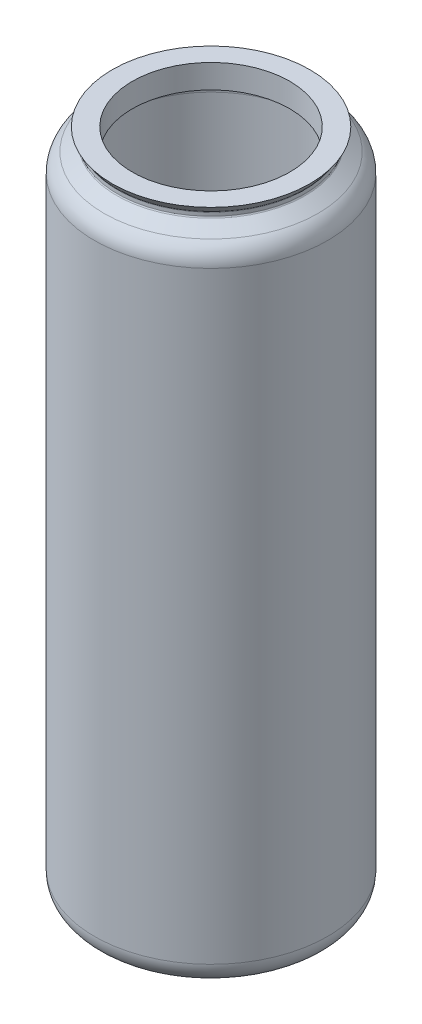
ISO-10303-21;
HEADER;
FILE_DESCRIPTION(('STEP AP214'),'2;1');
FILE_NAME('part.step','',(''),(''),'','','');
FILE_SCHEMA(('AUTOMOTIVE_DESIGN { 1 0 10303 214 1 1 1 1 }'));
ENDSEC;
DATA;
#1=APPLICATION_CONTEXT('core data for automotive mechanical design processes');
#2=APPLICATION_PROTOCOL_DEFINITION('international standard','automotive_design',2000,#1);
#3=PRODUCT_CONTEXT('',#1,'mechanical');
#4=PRODUCT('Part','Part','',(#3));
#5=PRODUCT_RELATED_PRODUCT_CATEGORY('part','',(#4));
#6=PRODUCT_DEFINITION_FORMATION('','',#4);
#7=PRODUCT_DEFINITION_CONTEXT('part definition',#1,'design');
#8=PRODUCT_DEFINITION('design','',#6,#7);
#9=PRODUCT_DEFINITION_SHAPE('','',#8);
#10=(LENGTH_UNIT() NAMED_UNIT(*) SI_UNIT(.MILLI.,.METRE.));
#11=(NAMED_UNIT(*) PLANE_ANGLE_UNIT() SI_UNIT($,.RADIAN.));
#12=(NAMED_UNIT(*) SI_UNIT($,.STERADIAN.) SOLID_ANGLE_UNIT());
#13=UNCERTAINTY_MEASURE_WITH_UNIT(LENGTH_MEASURE(1.E-05),#10,'distance_accuracy_value','');
#14=(GEOMETRIC_REPRESENTATION_CONTEXT(3) GLOBAL_UNCERTAINTY_ASSIGNED_CONTEXT((#13)) GLOBAL_UNIT_ASSIGNED_CONTEXT((#10,
#11,#12)) REPRESENTATION_CONTEXT('',''));
#15=CARTESIAN_POINT('',(0.,0.,0.));
#16=DIRECTION('',(0.,0.,1.));
#17=DIRECTION('',(1.,0.,0.));
#18=AXIS2_PLACEMENT_3D('',#15,#16,#17);
#19=CARTESIAN_POINT('',(0.,208.779461047513,0.));
#20=DIRECTION('',(0.,-1.,0.));
#21=DIRECTION('',(0.,0.,-1.));
#22=AXIS2_PLACEMENT_3D('',#19,#20,#21);
#23=TOROIDAL_SURFACE('',#22,31.2894047123911,7.62);
#24=CARTESIAN_POINT('',(0.,215.002199937633,0.));
#25=DIRECTION('',(0.,1.,0.));
#26=DIRECTION('',(0.,0.,1.));
#27=AXIS2_PLACEMENT_3D('',#24,#25,#26);
#28=CIRCLE('',#27,35.6873497672301);
#29=CARTESIAN_POINT('',(0.,215.002199937633,35.6873497672301));
#30=VERTEX_POINT('',#29);
#31=EDGE_CURVE('E63',#30,#30,#28,.T.);
#32=ORIENTED_EDGE('',*,*,#31,.F.);
#33=EDGE_LOOP('',(#32));
#34=FACE_BOUND('',#33,.T.);
#35=CARTESIAN_POINT('',(0.,208.779461047513,0.));
#36=DIRECTION('',(0.,-1.,0.));
#37=DIRECTION('',(0.,0.,-1.));
#38=AXIS2_PLACEMENT_3D('',#35,#36,#37);
#39=CIRCLE('',#38,38.9094047123911);
#40=CARTESIAN_POINT('',(0.,208.779461047513,-38.9094047123911));
#41=VERTEX_POINT('',#40);
#42=EDGE_CURVE('E60',#41,#41,#39,.T.);
#43=ORIENTED_EDGE('',*,*,#42,.F.);
#44=EDGE_LOOP('',(#43));
#45=FACE_BOUND('',#44,.T.);
#46=ADVANCED_FACE('F34',(#34,#45),#23,.T.);
#47=CARTESIAN_POINT('',(0.,0.,0.));
#48=DIRECTION('',(0.,1.,0.));
#49=DIRECTION('',(0.,0.,1.));
#50=AXIS2_PLACEMENT_3D('',#47,#48,#49);
#51=PLANE('',#50);
#52=CARTESIAN_POINT('',(0.,0.,0.));
#53=DIRECTION('',(0.,-1.,0.));
#54=DIRECTION('',(0.,0.,-1.));
#55=AXIS2_PLACEMENT_3D('',#52,#53,#54);
#56=CIRCLE('',#55,11.90625);
#57=CARTESIAN_POINT('',(0.,0.,-11.90625));
#58=VERTEX_POINT('',#57);
#59=EDGE_CURVE('E96',#58,#58,#56,.T.);
#60=ORIENTED_EDGE('',*,*,#59,.F.);
#61=EDGE_LOOP('',(#60));
#62=FACE_BOUND('',#61,.T.);
#63=CARTESIAN_POINT('',(0.,0.,0.));
#64=DIRECTION('',(0.,-1.,0.));
#65=DIRECTION('',(0.,0.,-1.));
#66=AXIS2_PLACEMENT_3D('',#63,#64,#65);
#67=CIRCLE('',#66,31.2894047123911);
#68=CARTESIAN_POINT('',(0.,0.,-31.2894047123911));
#69=VERTEX_POINT('',#68);
#70=EDGE_CURVE('E66',#69,#69,#67,.T.);
#71=ORIENTED_EDGE('',*,*,#70,.T.);
#72=EDGE_LOOP('',(#71));
#73=FACE_BOUND('',#72,.T.);
#74=ADVANCED_FACE('F122',(#62,#73),#51,.F.);
#75=CARTESIAN_POINT('',(0.,7.62,0.));
#76=DIRECTION('',(0.,-1.,0.));
#77=DIRECTION('',(0.,0.,-1.));
#78=AXIS2_PLACEMENT_3D('',#75,#76,#77);
#79=TOROIDAL_SURFACE('',#78,31.2894047123911,7.62);
#80=ORIENTED_EDGE('',*,*,#70,.F.);
#81=EDGE_LOOP('',(#80));
#82=FACE_BOUND('',#81,.T.);
#83=CARTESIAN_POINT('',(0.,7.62000000000005,0.));
#84=DIRECTION('',(0.,-1.,0.));
#85=DIRECTION('',(0.,0.,-1.));
#86=AXIS2_PLACEMENT_3D('',#83,#84,#85);
#87=CIRCLE('',#86,38.9094047123911);
#88=CARTESIAN_POINT('',(0.,7.62000000000005,-38.9094047123911));
#89=VERTEX_POINT('',#88);
#90=EDGE_CURVE('E69',#89,#89,#87,.T.);
#91=ORIENTED_EDGE('',*,*,#90,.T.);
#92=EDGE_LOOP('',(#91));
#93=FACE_BOUND('',#92,.T.);
#94=ADVANCED_FACE('F128',(#82,#93),#79,.T.);
#95=CARTESIAN_POINT('',(0.,0.,0.));
#96=DIRECTION('',(0.,-1.,0.));
#97=DIRECTION('',(0.,0.,-1.));
#98=AXIS2_PLACEMENT_3D('',#95,#96,#97);
#99=CYLINDRICAL_SURFACE('',#98,38.9094047123911);
#100=ORIENTED_EDGE('',*,*,#42,.T.);
#101=EDGE_LOOP('',(#100));
#102=FACE_BOUND('',#101,.T.);
#103=ORIENTED_EDGE('',*,*,#90,.F.);
#104=EDGE_LOOP('',(#103));
#105=FACE_BOUND('',#104,.T.);
#106=ADVANCED_FACE('F151',(#102,#105),#99,.T.);
#107=CARTESIAN_POINT('',(0.,218.159183173107,0.));
#108=DIRECTION('',(0.,-1.,0.));
#109=DIRECTION('',(0.,0.,-1.));
#110=AXIS2_PLACEMENT_3D('',#107,#108,#109);
#111=CONICAL_SURFACE('',#110,31.220472143731,0.955551903287283);
#112=CARTESIAN_POINT('',(0.,218.007369843931,0.));
#113=DIRECTION('',(0.,-1.,0.));
#114=DIRECTION('',(0.,0.,-1.));
#115=AXIS2_PLACEMENT_3D('',#112,#113,#114);
#116=CIRCLE('',#115,31.4352758067417);
#117=CARTESIAN_POINT('',(0.,218.007369843931,-31.4352758067417));
#118=VERTEX_POINT('',#117);
#119=EDGE_CURVE('E57',#118,#118,#116,.T.);
#120=ORIENTED_EDGE('',*,*,#119,.T.);
#121=EDGE_LOOP('',(#120));
#122=FACE_BOUND('',#121,.T.);
#123=ORIENTED_EDGE('',*,*,#31,.T.);
#124=EDGE_LOOP('',(#123));
#125=FACE_BOUND('',#124,.T.);
#126=ADVANCED_FACE('F147',(#122,#125),#111,.T.);
#127=CARTESIAN_POINT('',(0.,0.,0.));
#128=DIRECTION('',(0.,-1.,0.));
#129=DIRECTION('',(0.,0.,-1.));
#130=AXIS2_PLACEMENT_3D('',#127,#128,#129);
#131=CYLINDRICAL_SURFACE('',#130,31.2204721437309);
#132=CARTESIAN_POINT('',(0.,218.422219103273,0.));
#133=DIRECTION('',(0.,-1.,0.));
#134=DIRECTION('',(0.,0.,-1.));
#135=AXIS2_PLACEMENT_3D('',#132,#133,#134);
#136=CIRCLE('',#135,31.2204721437309);
#137=CARTESIAN_POINT('',(0.,218.422219103273,-31.2204721437309));
#138=VERTEX_POINT('',#137);
#139=EDGE_CURVE('E49',#138,#138,#136,.F.);
#140=ORIENTED_EDGE('',*,*,#139,.T.);
#141=EDGE_LOOP('',(#140));
#142=FACE_BOUND('',#141,.T.);
#143=CARTESIAN_POINT('',(0.,219.58528764975,0.));
#144=DIRECTION('',(0.,-1.,0.));
#145=DIRECTION('',(0.,0.,-1.));
#146=AXIS2_PLACEMENT_3D('',#143,#144,#145);
#147=CIRCLE('',#146,31.2204721437309);
#148=CARTESIAN_POINT('',(0.,219.58528764975,-31.2204721437309));
#149=VERTEX_POINT('',#148);
#150=EDGE_CURVE('E54',#149,#149,#147,.T.);
#151=ORIENTED_EDGE('',*,*,#150,.T.);
#152=EDGE_LOOP('',(#151));
#153=FACE_BOUND('',#152,.T.);
#154=ADVANCED_FACE('F150',(#142,#153),#131,.T.);
#155=CARTESIAN_POINT('',(0.,222.25,0.));
#156=DIRECTION('',(0.,1.,0.));
#157=DIRECTION('',(0.,0.,1.));
#158=AXIS2_PLACEMENT_3D('',#155,#156,#157);
#159=CONICAL_SURFACE('',#158,32.9897011044719,0.615244423507629);
#160=CARTESIAN_POINT('',(0.,219.87848398674,0.));
#161=DIRECTION('',(0.,1.,0.));
#162=DIRECTION('',(0.,0.,1.));
#163=AXIS2_PLACEMENT_3D('',#160,#161,#162);
#164=CIRCLE('',#163,31.3136228843896);
#165=CARTESIAN_POINT('',(0.,219.87848398674,31.3136228843896));
#166=VERTEX_POINT('',#165);
#167=EDGE_CURVE('E45',#166,#166,#164,.T.);
#168=ORIENTED_EDGE('',*,*,#167,.T.);
#169=EDGE_LOOP('',(#168));
#170=FACE_BOUND('',#169,.T.);
#171=CARTESIAN_POINT('',(0.,222.25,0.));
#172=DIRECTION('',(0.,-1.,0.));
#173=DIRECTION('',(0.,0.,-1.));
#174=AXIS2_PLACEMENT_3D('',#171,#172,#173);
#175=CIRCLE('',#174,32.9897011044719);
#176=CARTESIAN_POINT('',(0.,222.25,-32.9897011044719));
#177=VERTEX_POINT('',#176);
#178=EDGE_CURVE('E72',#177,#177,#175,.T.);
#179=ORIENTED_EDGE('',*,*,#178,.T.);
#180=EDGE_LOOP('',(#179));
#181=FACE_BOUND('',#180,.T.);
#182=ADVANCED_FACE('F157',(#170,#181),#159,.T.);
#183=CARTESIAN_POINT('',(-26.2764811044719,222.25,0.));
#184=DIRECTION('',(0.,-1.,0.));
#185=DIRECTION('',(0.,0.,-1.));
#186=AXIS2_PLACEMENT_3D('',#183,#184,#185);
#187=PLANE('',#186);
#188=ORIENTED_EDGE('',*,*,#178,.F.);
#189=EDGE_LOOP('',(#188));
#190=FACE_BOUND('',#189,.T.);
#191=CARTESIAN_POINT('',(0.,222.25,0.));
#192=DIRECTION('',(0.,-1.,0.));
#193=DIRECTION('',(0.,0.,-1.));
#194=AXIS2_PLACEMENT_3D('',#191,#192,#193);
#195=CIRCLE('',#194,26.2764811044719);
#196=CARTESIAN_POINT('',(0.,222.25,-26.2764811044719));
#197=VERTEX_POINT('',#196);
#198=EDGE_CURVE('E75',#197,#197,#195,.T.);
#199=ORIENTED_EDGE('',*,*,#198,.T.);
#200=EDGE_LOOP('',(#199));
#201=FACE_BOUND('',#200,.T.);
#202=ADVANCED_FACE('F201',(#190,#201),#187,.F.);
#203=CARTESIAN_POINT('',(0.,0.,0.));
#204=DIRECTION('',(0.,-1.,0.));
#205=DIRECTION('',(0.,0.,-1.));
#206=AXIS2_PLACEMENT_3D('',#203,#204,#205);
#207=CYLINDRICAL_SURFACE('',#206,26.2764811044719);
#208=ORIENTED_EDGE('',*,*,#198,.F.);
#209=EDGE_LOOP('',(#208));
#210=FACE_BOUND('',#209,.T.);
#211=CARTESIAN_POINT('',(0.,214.3125,0.));
#212=DIRECTION('',(0.,-1.,0.));
#213=DIRECTION('',(0.,0.,-1.));
#214=AXIS2_PLACEMENT_3D('',#211,#212,#213);
#215=CIRCLE('',#214,26.2764811044719);
#216=CARTESIAN_POINT('',(0.,214.3125,-26.2764811044719));
#217=VERTEX_POINT('',#216);
#218=EDGE_CURVE('E78',#217,#217,#215,.T.);
#219=ORIENTED_EDGE('',*,*,#218,.T.);
#220=EDGE_LOOP('',(#219));
#221=FACE_BOUND('',#220,.T.);
#222=ADVANCED_FACE('F296',(#210,#221),#207,.F.);
#223=CARTESIAN_POINT('',(-26.2764811044719,214.3125,0.));
#224=DIRECTION('',(0.,1.,0.));
#225=DIRECTION('',(0.,0.,1.));
#226=AXIS2_PLACEMENT_3D('',#223,#224,#225);
#227=PLANE('',#226);
#228=ORIENTED_EDGE('',*,*,#218,.F.);
#229=EDGE_LOOP('',(#228));
#230=FACE_BOUND('',#229,.T.);
#231=CARTESIAN_POINT('',(0.,214.3125,0.));
#232=DIRECTION('',(0.,-1.,0.));
#233=DIRECTION('',(0.,0.,-1.));
#234=AXIS2_PLACEMENT_3D('',#231,#232,#233);
#235=CIRCLE('',#234,27.4794047123911);
#236=CARTESIAN_POINT('',(0.,214.3125,-27.4794047123911));
#237=VERTEX_POINT('',#236);
#238=EDGE_CURVE('E81',#237,#237,#235,.T.);
#239=ORIENTED_EDGE('',*,*,#238,.T.);
#240=EDGE_LOOP('',(#239));
#241=FACE_BOUND('',#240,.T.);
#242=ADVANCED_FACE('F287',(#230,#241),#227,.F.);
#243=CARTESIAN_POINT('',(0.,209.2325,0.));
#244=DIRECTION('',(0.,-1.,0.));
#245=DIRECTION('',(0.,0.,-1.));
#246=AXIS2_PLACEMENT_3D('',#243,#244,#245);
#247=TOROIDAL_SURFACE('',#246,27.4794047123911,5.08);
#248=ORIENTED_EDGE('',*,*,#238,.F.);
#249=EDGE_LOOP('',(#248));
#250=FACE_BOUND('',#249,.T.);
#251=CARTESIAN_POINT('',(0.,209.2325,0.));
#252=DIRECTION('',(0.,-1.,0.));
#253=DIRECTION('',(0.,0.,-1.));
#254=AXIS2_PLACEMENT_3D('',#251,#252,#253);
#255=CIRCLE('',#254,32.5594047123911);
#256=CARTESIAN_POINT('',(0.,209.2325,-32.5594047123911));
#257=VERTEX_POINT('',#256);
#258=EDGE_CURVE('E84',#257,#257,#255,.T.);
#259=ORIENTED_EDGE('',*,*,#258,.T.);
#260=EDGE_LOOP('',(#259));
#261=FACE_BOUND('',#260,.T.);
#262=ADVANCED_FACE('F278',(#250,#261),#247,.F.);
#263=CARTESIAN_POINT('',(0.,0.,0.));
#264=DIRECTION('',(0.,-1.,0.));
#265=DIRECTION('',(0.,0.,-1.));
#266=AXIS2_PLACEMENT_3D('',#263,#264,#265);
#267=CYLINDRICAL_SURFACE('',#266,32.5594047123911);
#268=ORIENTED_EDGE('',*,*,#258,.F.);
#269=EDGE_LOOP('',(#268));
#270=FACE_BOUND('',#269,.T.);
#271=CARTESIAN_POINT('',(0.,25.4,0.));
#272=DIRECTION('',(0.,-1.,0.));
#273=DIRECTION('',(0.,0.,-1.));
#274=AXIS2_PLACEMENT_3D('',#271,#272,#273);
#275=CIRCLE('',#274,32.5594047123911);
#276=CARTESIAN_POINT('',(0.,25.4,-32.5594047123911));
#277=VERTEX_POINT('',#276);
#278=EDGE_CURVE('E87',#277,#277,#275,.T.);
#279=ORIENTED_EDGE('',*,*,#278,.T.);
#280=EDGE_LOOP('',(#279));
#281=FACE_BOUND('',#280,.T.);
#282=ADVANCED_FACE('F269',(#270,#281),#267,.F.);
#283=CARTESIAN_POINT('',(0.,31.3495979749317,0.));
#284=DIRECTION('',(0.,-1.,0.));
#285=DIRECTION('',(0.,0.,-1.));
#286=AXIS2_PLACEMENT_3D('',#283,#284,#285);
#287=TOROIDAL_SURFACE('',#286,21.7945361910559,12.2995979749317);
#288=ORIENTED_EDGE('',*,*,#278,.F.);
#289=EDGE_LOOP('',(#288));
#290=FACE_BOUND('',#289,.T.);
#291=CARTESIAN_POINT('',(0.,19.05,0.));
#292=DIRECTION('',(0.,-1.,0.));
#293=DIRECTION('',(0.,0.,-1.));
#294=AXIS2_PLACEMENT_3D('',#291,#292,#293);
#295=CIRCLE('',#294,21.794536191056);
#296=CARTESIAN_POINT('',(0.,19.05,-21.794536191056));
#297=VERTEX_POINT('',#296);
#298=EDGE_CURVE('E90',#297,#297,#295,.T.);
#299=ORIENTED_EDGE('',*,*,#298,.T.);
#300=EDGE_LOOP('',(#299));
#301=FACE_BOUND('',#300,.T.);
#302=ADVANCED_FACE('F260',(#290,#301),#287,.F.);
#303=CARTESIAN_POINT('',(0.,36.3506930672623,0.));
#304=DIRECTION('',(0.,-1.,0.));
#305=DIRECTION('',(0.,0.,-1.));
#306=AXIS2_PLACEMENT_3D('',#303,#304,#305);
#307=TOROIDAL_SURFACE('',#306,26.0313870377475,17.8119309931498);
#308=ORIENTED_EDGE('',*,*,#298,.F.);
#309=EDGE_LOOP('',(#308));
#310=FACE_BOUND('',#309,.T.);
#311=CARTESIAN_POINT('',(0.,20.8528608159918,0.));
#312=DIRECTION('',(0.,-1.,0.));
#313=DIRECTION('',(0.,0.,-1.));
#314=AXIS2_PLACEMENT_3D('',#311,#312,#313);
#315=CIRCLE('',#314,17.2517468847453);
#316=CARTESIAN_POINT('',(0.,20.8528608159918,-17.2517468847453));
#317=VERTEX_POINT('',#316);
#318=EDGE_CURVE('E93',#317,#317,#315,.T.);
#319=ORIENTED_EDGE('',*,*,#318,.T.);
#320=EDGE_LOOP('',(#319));
#321=FACE_BOUND('',#320,.T.);
#322=ADVANCED_FACE('F141',(#310,#321),#307,.F.);
#323=CARTESIAN_POINT('',(0.,-9.59994529016022,0.));
#324=DIRECTION('',(0.,-1.,0.));
#325=DIRECTION('',(-1.,0.,0.));
#326=AXIS2_PLACEMENT_3D('',#323,#324,#325);
#327=SPHERICAL_SURFACE('',#326,34.9999452901602);
#328=ORIENTED_EDGE('',*,*,#318,.F.);
#329=EDGE_LOOP('',(#328));
#330=FACE_BOUND('',#329,.T.);
#331=ADVANCED_FACE('F136',(#330),#327,.T.);
#332=CARTESIAN_POINT('',(0.,218.422219103273,0.));
#333=DIRECTION('',(0.,-1.,0.));
#334=DIRECTION('',(0.,0.,-1.));
#335=AXIS2_PLACEMENT_3D('',#332,#333,#334);
#336=TOROIDAL_SURFACE('',#335,31.7284721437309,0.508);
#337=ORIENTED_EDGE('',*,*,#139,.F.);
#338=EDGE_LOOP('',(#337));
#339=FACE_BOUND('',#338,.T.);
#340=ORIENTED_EDGE('',*,*,#119,.F.);
#341=EDGE_LOOP('',(#340));
#342=FACE_BOUND('',#341,.T.);
#343=ADVANCED_FACE('F116',(#339,#342),#336,.F.);
#344=CARTESIAN_POINT('',(0.,219.58528764975,0.));
#345=DIRECTION('',(0.,-1.,0.));
#346=DIRECTION('',(0.,0.,-1.));
#347=AXIS2_PLACEMENT_3D('',#344,#345,#346);
#348=TOROIDAL_SURFACE('',#347,31.7284721437309,0.508);
#349=ORIENTED_EDGE('',*,*,#167,.F.);
#350=EDGE_LOOP('',(#349));
#351=FACE_BOUND('',#350,.T.);
#352=ORIENTED_EDGE('',*,*,#150,.F.);
#353=EDGE_LOOP('',(#352));
#354=FACE_BOUND('',#353,.T.);
#355=ADVANCED_FACE('F108',(#351,#354),#348,.F.);
#356=CARTESIAN_POINT('',(0.,0.396875,0.));
#357=DIRECTION('',(0.,-1.,0.));
#358=DIRECTION('',(0.,0.,-1.));
#359=AXIS2_PLACEMENT_3D('',#356,#357,#358);
#360=PLANE('',#359);
#361=CARTESIAN_POINT('',(0.,0.396875,0.));
#362=DIRECTION('',(0.,-1.,0.));
#363=DIRECTION('',(0.,0.,-1.));
#364=AXIS2_PLACEMENT_3D('',#361,#362,#363);
#365=CIRCLE('',#364,6.35);
#366=CARTESIAN_POINT('',(0.,0.396875,-6.35));
#367=VERTEX_POINT('',#366);
#368=EDGE_CURVE('E99',#367,#367,#365,.T.);
#369=ORIENTED_EDGE('',*,*,#368,.F.);
#370=EDGE_LOOP('',(#369));
#371=FACE_BOUND('',#370,.T.);
#372=CARTESIAN_POINT('',(0.,0.396875,0.));
#373=DIRECTION('',(0.,-1.,0.));
#374=DIRECTION('',(0.,0.,-1.));
#375=AXIS2_PLACEMENT_3D('',#372,#373,#374);
#376=CIRCLE('',#375,10.5429396045379);
#377=CARTESIAN_POINT('',(0.,0.396875,-10.5429396045379));
#378=VERTEX_POINT('',#377);
#379=EDGE_CURVE('E41',#378,#378,#376,.T.);
#380=ORIENTED_EDGE('',*,*,#379,.T.);
#381=EDGE_LOOP('',(#380));
#382=FACE_BOUND('',#381,.T.);
#383=ADVANCED_FACE('F105',(#371,#382),#360,.T.);
#384=CARTESIAN_POINT('',(0.,-2.143125,0.));
#385=DIRECTION('',(0.,1.,0.));
#386=DIRECTION('',(0.,0.,1.));
#387=AXIS2_PLACEMENT_3D('',#384,#385,#386);
#388=TOROIDAL_SURFACE('',#387,10.5429396045379,2.54);
#389=ORIENTED_EDGE('',*,*,#59,.T.);
#390=EDGE_LOOP('',(#389));
#391=FACE_BOUND('',#390,.T.);
#392=ORIENTED_EDGE('',*,*,#379,.F.);
#393=EDGE_LOOP('',(#392));
#394=FACE_BOUND('',#393,.T.);
#395=ADVANCED_FACE('F107',(#391,#394),#388,.F.);
#396=CARTESIAN_POINT('',(0.,0.79375,0.));
#397=DIRECTION('',(0.,-1.,0.));
#398=DIRECTION('',(0.,0.,-1.));
#399=AXIS2_PLACEMENT_3D('',#396,#397,#398);
#400=PLANE('',#399);
#401=CARTESIAN_POINT('',(0.,0.79375,0.));
#402=DIRECTION('',(0.,-1.,0.));
#403=DIRECTION('',(0.,0.,-1.));
#404=AXIS2_PLACEMENT_3D('',#401,#402,#403);
#405=CIRCLE('',#404,5.76133924508678);
#406=CARTESIAN_POINT('',(0.,0.79375,-5.76133924508678));
#407=VERTEX_POINT('',#406);
#408=EDGE_CURVE('E10',#407,#407,#405,.T.);
#409=ORIENTED_EDGE('',*,*,#408,.T.);
#410=EDGE_LOOP('',(#409));
#411=FACE_BOUND('',#410,.T.);
#412=ADVANCED_FACE('F114',(#411),#400,.T.);
#413=CARTESIAN_POINT('',(0.,0.15875,0.));
#414=DIRECTION('',(0.,1.,0.));
#415=DIRECTION('',(0.,0.,1.));
#416=AXIS2_PLACEMENT_3D('',#413,#414,#415);
#417=TOROIDAL_SURFACE('',#416,5.76133924508678,0.635);
#418=ORIENTED_EDGE('',*,*,#368,.T.);
#419=EDGE_LOOP('',(#418));
#420=FACE_BOUND('',#419,.T.);
#421=ORIENTED_EDGE('',*,*,#408,.F.);
#422=EDGE_LOOP('',(#421));
#423=FACE_BOUND('',#422,.T.);
#424=ADVANCED_FACE('F36',(#420,#423),#417,.F.);
#425=CLOSED_SHELL('',(#46,#74,#94,#106,#126,#154,#182,#202,#222,#242,#262,#282,#302,#322,#331,
#343,#355,#383,#395,#412,#424));
#426=MANIFOLD_SOLID_BREP('B2',#425);
#427=ADVANCED_BREP_SHAPE_REPRESENTATION('',(#18,#426),#14);
#428=SHAPE_DEFINITION_REPRESENTATION(#9,#427);
ENDSEC;
END-ISO-10303-21;
